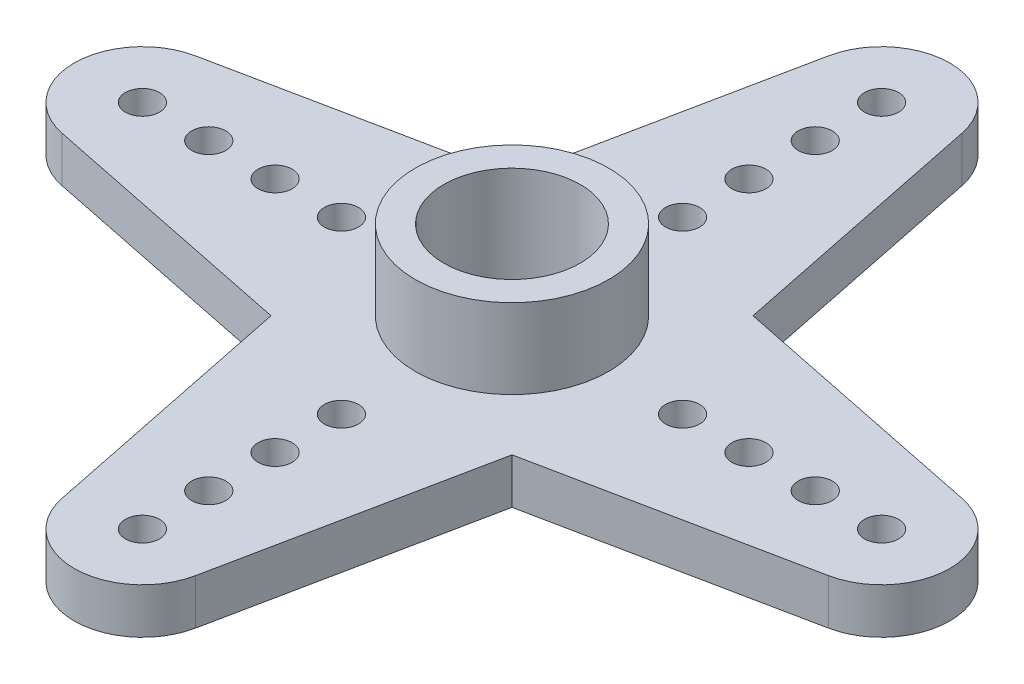
ISO-10303-21;
HEADER;
FILE_DESCRIPTION(('STEP AP214'),'2;1');
FILE_NAME('part.step','',(''),(''),'','','');
FILE_SCHEMA(('AUTOMOTIVE_DESIGN { 1 0 10303 214 1 1 1 1 }'));
ENDSEC;
DATA;
#1=APPLICATION_CONTEXT('core data for automotive mechanical design processes');
#2=APPLICATION_PROTOCOL_DEFINITION('international standard','automotive_design',2000,#1);
#3=PRODUCT_CONTEXT('',#1,'mechanical');
#4=PRODUCT('Part','Part','',(#3));
#5=PRODUCT_RELATED_PRODUCT_CATEGORY('part','',(#4));
#6=PRODUCT_DEFINITION_FORMATION('','',#4);
#7=PRODUCT_DEFINITION_CONTEXT('part definition',#1,'design');
#8=PRODUCT_DEFINITION('design','',#6,#7);
#9=PRODUCT_DEFINITION_SHAPE('','',#8);
#10=(LENGTH_UNIT() NAMED_UNIT(*) SI_UNIT(.MILLI.,.METRE.));
#11=(NAMED_UNIT(*) PLANE_ANGLE_UNIT() SI_UNIT($,.RADIAN.));
#12=(NAMED_UNIT(*) SI_UNIT($,.STERADIAN.) SOLID_ANGLE_UNIT());
#13=UNCERTAINTY_MEASURE_WITH_UNIT(LENGTH_MEASURE(1.E-05),#10,'distance_accuracy_value','');
#14=(GEOMETRIC_REPRESENTATION_CONTEXT(3) GLOBAL_UNCERTAINTY_ASSIGNED_CONTEXT((#13)) GLOBAL_UNIT_ASSIGNED_CONTEXT((#10,
#11,#12)) REPRESENTATION_CONTEXT('',''));
#15=CARTESIAN_POINT('',(0.,0.,0.));
#16=DIRECTION('',(0.,0.,1.));
#17=DIRECTION('',(1.,0.,0.));
#18=AXIS2_PLACEMENT_3D('',#15,#16,#17);
#19=CARTESIAN_POINT('',(6.12372435695795,2.,-1.25));
#20=DIRECTION('',(0.979795897113271,0.,-0.2));
#21=DIRECTION('',(-0.2,0.,-0.979795897113271));
#22=AXIS2_PLACEMENT_3D('',#19,#20,#21);
#23=PLANE('',#22);
#24=DIRECTION('',(0.2,0.,0.979795897113271));
#25=VECTOR('',#24,1.);
#26=CARTESIAN_POINT('',(6.12372435695795,0.,-1.25));
#27=LINE('',#26,#25);
#28=CARTESIAN_POINT('',(2.93938769133982,0.,-16.85));
#29=VERTEX_POINT('',#28);
#30=CARTESIAN_POINT('',(5.29752647495429,0.,-5.29752647495429));
#31=VERTEX_POINT('',#30);
#32=EDGE_CURVE('E207',#29,#31,#27,.T.);
#33=ORIENTED_EDGE('',*,*,#32,.F.);
#34=DIRECTION('',(0.,-1.,0.));
#35=VECTOR('',#34,1.);
#36=CARTESIAN_POINT('',(2.93938769133982,2.,-16.85));
#37=LINE('',#36,#35);
#38=CARTESIAN_POINT('',(2.93938769133982,2.,-16.85));
#39=VERTEX_POINT('',#38);
#40=EDGE_CURVE('E42',#39,#29,#37,.T.);
#41=ORIENTED_EDGE('',*,*,#40,.F.);
#42=DIRECTION('',(0.2,0.,0.979795897113271));
#43=VECTOR('',#42,1.);
#44=CARTESIAN_POINT('',(6.12372435695795,2.,-1.25));
#45=LINE('',#44,#43);
#46=CARTESIAN_POINT('',(5.29752647495429,2.,-5.29752647495429));
#47=VERTEX_POINT('',#46);
#48=EDGE_CURVE('E462',#39,#47,#45,.T.);
#49=ORIENTED_EDGE('',*,*,#48,.T.);
#50=DIRECTION('',(0.,-1.,0.));
#51=VECTOR('',#50,1.);
#52=CARTESIAN_POINT('',(5.29752647495429,2.,-5.29752647495429));
#53=LINE('',#52,#51);
#54=EDGE_CURVE('E50',#47,#31,#53,.T.);
#55=ORIENTED_EDGE('',*,*,#54,.T.);
#56=EDGE_LOOP('',(#33,#41,#49,#55));
#57=FACE_BOUND('',#56,.T.);
#58=ADVANCED_FACE('F33',(#57),#23,.T.);
#59=CARTESIAN_POINT('',(0.,2.,-16.25));
#60=DIRECTION('',(0.,-1.,0.));
#61=DIRECTION('',(0.,0.,-1.));
#62=AXIS2_PLACEMENT_3D('',#59,#60,#61);
#63=CYLINDRICAL_SURFACE('',#62,3.);
#64=CARTESIAN_POINT('',(0.,0.,-16.25));
#65=DIRECTION('',(0.,1.,0.));
#66=DIRECTION('',(0.,0.,1.));
#67=AXIS2_PLACEMENT_3D('',#64,#65,#66);
#68=CIRCLE('',#67,3.);
#69=CARTESIAN_POINT('',(-2.93938769133981,0.,-16.85));
#70=VERTEX_POINT('',#69);
#71=EDGE_CURVE('E209',#29,#70,#68,.T.);
#72=ORIENTED_EDGE('',*,*,#71,.T.);
#73=DIRECTION('',(0.,-1.,0.));
#74=VECTOR('',#73,1.);
#75=CARTESIAN_POINT('',(-2.93938769133981,2.,-16.85));
#76=LINE('',#75,#74);
#77=CARTESIAN_POINT('',(-2.93938769133981,2.,-16.85));
#78=VERTEX_POINT('',#77);
#79=EDGE_CURVE('E299',#78,#70,#76,.T.);
#80=ORIENTED_EDGE('',*,*,#79,.F.);
#81=CARTESIAN_POINT('',(0.,2.,-16.25));
#82=DIRECTION('',(0.,1.,0.));
#83=DIRECTION('',(0.,0.,1.));
#84=AXIS2_PLACEMENT_3D('',#81,#82,#83);
#85=CIRCLE('',#84,3.);
#86=EDGE_CURVE('E306',#39,#78,#85,.T.);
#87=ORIENTED_EDGE('',*,*,#86,.F.);
#88=ORIENTED_EDGE('',*,*,#40,.T.);
#89=EDGE_LOOP('',(#72,#80,#87,#88));
#90=FACE_BOUND('',#89,.T.);
#91=ADVANCED_FACE('F303',(#90),#63,.T.);
#92=CARTESIAN_POINT('',(-6.12372435695795,2.,-1.25));
#93=DIRECTION('',(0.979795897113271,0.,0.2));
#94=DIRECTION('',(0.2,0.,-0.979795897113271));
#95=AXIS2_PLACEMENT_3D('',#92,#93,#94);
#96=PLANE('',#95);
#97=DIRECTION('',(-0.2,0.,0.979795897113271));
#98=VECTOR('',#97,1.);
#99=CARTESIAN_POINT('',(-6.12372435695795,0.,-1.25));
#100=LINE('',#99,#98);
#101=CARTESIAN_POINT('',(-5.29752647495429,0.,-5.29752647495429));
#102=VERTEX_POINT('',#101);
#103=EDGE_CURVE('E212',#70,#102,#100,.T.);
#104=ORIENTED_EDGE('',*,*,#103,.T.);
#105=DIRECTION('',(0.,-1.,0.));
#106=VECTOR('',#105,1.);
#107=CARTESIAN_POINT('',(-5.29752647495429,2.,-5.29752647495429));
#108=LINE('',#107,#106);
#109=CARTESIAN_POINT('',(-5.29752647495429,2.,-5.29752647495429));
#110=VERTEX_POINT('',#109);
#111=EDGE_CURVE('E297',#110,#102,#108,.T.);
#112=ORIENTED_EDGE('',*,*,#111,.F.);
#113=DIRECTION('',(-0.2,0.,0.979795897113271));
#114=VECTOR('',#113,1.);
#115=CARTESIAN_POINT('',(-6.12372435695795,2.,-1.25));
#116=LINE('',#115,#114);
#117=EDGE_CURVE('E444',#78,#110,#116,.T.);
#118=ORIENTED_EDGE('',*,*,#117,.F.);
#119=ORIENTED_EDGE('',*,*,#79,.T.);
#120=EDGE_LOOP('',(#104,#112,#118,#119));
#121=FACE_BOUND('',#120,.T.);
#122=ADVANCED_FACE('F315',(#121),#96,.F.);
#123=CARTESIAN_POINT('',(-1.25,2.,-6.12372435695794));
#124=DIRECTION('',(-0.2,0.,-0.979795897113271));
#125=DIRECTION('',(-0.979795897113271,0.,0.2));
#126=AXIS2_PLACEMENT_3D('',#123,#124,#125);
#127=PLANE('',#126);
#128=DIRECTION('',(0.979795897113271,0.,-0.2));
#129=VECTOR('',#128,1.);
#130=CARTESIAN_POINT('',(-1.25,0.,-6.12372435695794));
#131=LINE('',#130,#129);
#132=CARTESIAN_POINT('',(-16.85,0.,-2.93938769133981));
#133=VERTEX_POINT('',#132);
#134=EDGE_CURVE('E215',#133,#102,#131,.T.);
#135=ORIENTED_EDGE('',*,*,#134,.F.);
#136=DIRECTION('',(0.,-1.,0.));
#137=VECTOR('',#136,1.);
#138=CARTESIAN_POINT('',(-16.85,2.,-2.93938769133981));
#139=LINE('',#138,#137);
#140=CARTESIAN_POINT('',(-16.85,2.,-2.93938769133981));
#141=VERTEX_POINT('',#140);
#142=EDGE_CURVE('E295',#141,#133,#139,.T.);
#143=ORIENTED_EDGE('',*,*,#142,.F.);
#144=DIRECTION('',(0.979795897113271,0.,-0.2));
#145=VECTOR('',#144,1.);
#146=CARTESIAN_POINT('',(-1.25,2.,-6.12372435695794));
#147=LINE('',#146,#145);
#148=EDGE_CURVE('E441',#141,#110,#147,.T.);
#149=ORIENTED_EDGE('',*,*,#148,.T.);
#150=ORIENTED_EDGE('',*,*,#111,.T.);
#151=EDGE_LOOP('',(#135,#143,#149,#150));
#152=FACE_BOUND('',#151,.T.);
#153=ADVANCED_FACE('F427',(#152),#127,.T.);
#154=CARTESIAN_POINT('',(-16.25,2.,0.));
#155=DIRECTION('',(0.,-1.,0.));
#156=DIRECTION('',(0.,0.,-1.));
#157=AXIS2_PLACEMENT_3D('',#154,#155,#156);
#158=CYLINDRICAL_SURFACE('',#157,3.);
#159=CARTESIAN_POINT('',(-16.25,0.,0.));
#160=DIRECTION('',(0.,1.,0.));
#161=DIRECTION('',(0.,0.,1.));
#162=AXIS2_PLACEMENT_3D('',#159,#160,#161);
#163=CIRCLE('',#162,3.);
#164=CARTESIAN_POINT('',(-16.85,0.,2.93938769133981));
#165=VERTEX_POINT('',#164);
#166=EDGE_CURVE('E218',#133,#165,#163,.T.);
#167=ORIENTED_EDGE('',*,*,#166,.T.);
#168=DIRECTION('',(0.,-1.,0.));
#169=VECTOR('',#168,1.);
#170=CARTESIAN_POINT('',(-16.85,2.,2.93938769133981));
#171=LINE('',#170,#169);
#172=CARTESIAN_POINT('',(-16.85,2.,2.93938769133981));
#173=VERTEX_POINT('',#172);
#174=EDGE_CURVE('E292',#173,#165,#171,.T.);
#175=ORIENTED_EDGE('',*,*,#174,.F.);
#176=CARTESIAN_POINT('',(-16.25,2.,0.));
#177=DIRECTION('',(0.,1.,0.));
#178=DIRECTION('',(0.,0.,1.));
#179=AXIS2_PLACEMENT_3D('',#176,#177,#178);
#180=CIRCLE('',#179,3.);
#181=EDGE_CURVE('E443',#141,#173,#180,.T.);
#182=ORIENTED_EDGE('',*,*,#181,.F.);
#183=ORIENTED_EDGE('',*,*,#142,.T.);
#184=EDGE_LOOP('',(#167,#175,#182,#183));
#185=FACE_BOUND('',#184,.T.);
#186=ADVANCED_FACE('F423',(#185),#158,.T.);
#187=CARTESIAN_POINT('',(-1.25,2.,6.12372435695794));
#188=DIRECTION('',(0.2,0.,-0.979795897113271));
#189=DIRECTION('',(-0.979795897113271,0.,-0.2));
#190=AXIS2_PLACEMENT_3D('',#187,#188,#189);
#191=PLANE('',#190);
#192=DIRECTION('',(0.979795897113271,0.,0.2));
#193=VECTOR('',#192,1.);
#194=CARTESIAN_POINT('',(-1.25,0.,6.12372435695794));
#195=LINE('',#194,#193);
#196=CARTESIAN_POINT('',(-5.29752647495429,0.,5.29752647495429));
#197=VERTEX_POINT('',#196);
#198=EDGE_CURVE('E221',#165,#197,#195,.T.);
#199=ORIENTED_EDGE('',*,*,#198,.T.);
#200=DIRECTION('',(0.,-1.,0.));
#201=VECTOR('',#200,1.);
#202=CARTESIAN_POINT('',(-5.29752647495429,2.,5.29752647495429));
#203=LINE('',#202,#201);
#204=CARTESIAN_POINT('',(-5.29752647495429,2.,5.29752647495429));
#205=VERTEX_POINT('',#204);
#206=EDGE_CURVE('E290',#205,#197,#203,.T.);
#207=ORIENTED_EDGE('',*,*,#206,.F.);
#208=DIRECTION('',(0.979795897113271,0.,0.2));
#209=VECTOR('',#208,1.);
#210=CARTESIAN_POINT('',(-1.25,2.,6.12372435695794));
#211=LINE('',#210,#209);
#212=EDGE_CURVE('E446',#173,#205,#211,.T.);
#213=ORIENTED_EDGE('',*,*,#212,.F.);
#214=ORIENTED_EDGE('',*,*,#174,.T.);
#215=EDGE_LOOP('',(#199,#207,#213,#214));
#216=FACE_BOUND('',#215,.T.);
#217=ADVANCED_FACE('F419',(#216),#191,.F.);
#218=CARTESIAN_POINT('',(-6.12372435695795,2.,1.25));
#219=DIRECTION('',(-0.979795897113271,0.,0.2));
#220=DIRECTION('',(0.2,0.,0.979795897113271));
#221=AXIS2_PLACEMENT_3D('',#218,#219,#220);
#222=PLANE('',#221);
#223=DIRECTION('',(-0.2,0.,-0.979795897113271));
#224=VECTOR('',#223,1.);
#225=CARTESIAN_POINT('',(-6.12372435695795,0.,1.25));
#226=LINE('',#225,#224);
#227=CARTESIAN_POINT('',(-2.93938769133981,0.,16.85));
#228=VERTEX_POINT('',#227);
#229=EDGE_CURVE('E224',#228,#197,#226,.T.);
#230=ORIENTED_EDGE('',*,*,#229,.F.);
#231=DIRECTION('',(0.,-1.,0.));
#232=VECTOR('',#231,1.);
#233=CARTESIAN_POINT('',(-2.93938769133981,2.,16.85));
#234=LINE('',#233,#232);
#235=CARTESIAN_POINT('',(-2.93938769133981,2.,16.85));
#236=VERTEX_POINT('',#235);
#237=EDGE_CURVE('E288',#236,#228,#234,.T.);
#238=ORIENTED_EDGE('',*,*,#237,.F.);
#239=DIRECTION('',(-0.2,0.,-0.979795897113271));
#240=VECTOR('',#239,1.);
#241=CARTESIAN_POINT('',(-6.12372435695795,2.,1.25));
#242=LINE('',#241,#240);
#243=EDGE_CURVE('E452',#236,#205,#242,.T.);
#244=ORIENTED_EDGE('',*,*,#243,.T.);
#245=ORIENTED_EDGE('',*,*,#206,.T.);
#246=EDGE_LOOP('',(#230,#238,#244,#245));
#247=FACE_BOUND('',#246,.T.);
#248=ADVANCED_FACE('F415',(#247),#222,.T.);
#249=CARTESIAN_POINT('',(0.,2.,16.25));
#250=DIRECTION('',(0.,-1.,0.));
#251=DIRECTION('',(0.,0.,-1.));
#252=AXIS2_PLACEMENT_3D('',#249,#250,#251);
#253=CYLINDRICAL_SURFACE('',#252,3.);
#254=CARTESIAN_POINT('',(0.,0.,16.25));
#255=DIRECTION('',(0.,1.,0.));
#256=DIRECTION('',(0.,0.,1.));
#257=AXIS2_PLACEMENT_3D('',#254,#255,#256);
#258=CIRCLE('',#257,3.);
#259=CARTESIAN_POINT('',(2.93938769133982,0.,16.85));
#260=VERTEX_POINT('',#259);
#261=EDGE_CURVE('E227',#228,#260,#258,.T.);
#262=ORIENTED_EDGE('',*,*,#261,.T.);
#263=DIRECTION('',(0.,-1.,0.));
#264=VECTOR('',#263,1.);
#265=CARTESIAN_POINT('',(2.93938769133982,2.,16.85));
#266=LINE('',#265,#264);
#267=CARTESIAN_POINT('',(2.93938769133982,2.,16.85));
#268=VERTEX_POINT('',#267);
#269=EDGE_CURVE('E285',#268,#260,#266,.T.);
#270=ORIENTED_EDGE('',*,*,#269,.F.);
#271=CARTESIAN_POINT('',(0.,2.,16.25));
#272=DIRECTION('',(0.,1.,0.));
#273=DIRECTION('',(0.,0.,1.));
#274=AXIS2_PLACEMENT_3D('',#271,#272,#273);
#275=CIRCLE('',#274,3.);
#276=EDGE_CURVE('E150',#236,#268,#275,.T.);
#277=ORIENTED_EDGE('',*,*,#276,.F.);
#278=ORIENTED_EDGE('',*,*,#237,.T.);
#279=EDGE_LOOP('',(#262,#270,#277,#278));
#280=FACE_BOUND('',#279,.T.);
#281=ADVANCED_FACE('F411',(#280),#253,.T.);
#282=CARTESIAN_POINT('',(6.12372435695795,2.,1.25));
#283=DIRECTION('',(-0.979795897113271,0.,-0.2));
#284=DIRECTION('',(-0.2,0.,0.979795897113271));
#285=AXIS2_PLACEMENT_3D('',#282,#283,#284);
#286=PLANE('',#285);
#287=DIRECTION('',(0.2,0.,-0.979795897113271));
#288=VECTOR('',#287,1.);
#289=CARTESIAN_POINT('',(6.12372435695795,0.,1.25));
#290=LINE('',#289,#288);
#291=CARTESIAN_POINT('',(5.29752647495429,0.,5.29752647495429));
#292=VERTEX_POINT('',#291);
#293=EDGE_CURVE('E230',#260,#292,#290,.T.);
#294=ORIENTED_EDGE('',*,*,#293,.T.);
#295=DIRECTION('',(0.,-1.,0.));
#296=VECTOR('',#295,1.);
#297=CARTESIAN_POINT('',(5.29752647495429,2.,5.29752647495429));
#298=LINE('',#297,#296);
#299=CARTESIAN_POINT('',(5.29752647495429,2.,5.29752647495429));
#300=VERTEX_POINT('',#299);
#301=EDGE_CURVE('E135',#300,#292,#298,.T.);
#302=ORIENTED_EDGE('',*,*,#301,.F.);
#303=DIRECTION('',(0.2,0.,-0.979795897113271));
#304=VECTOR('',#303,1.);
#305=CARTESIAN_POINT('',(6.12372435695795,2.,1.25));
#306=LINE('',#305,#304);
#307=EDGE_CURVE('E147',#268,#300,#306,.T.);
#308=ORIENTED_EDGE('',*,*,#307,.F.);
#309=ORIENTED_EDGE('',*,*,#269,.T.);
#310=EDGE_LOOP('',(#294,#302,#308,#309));
#311=FACE_BOUND('',#310,.T.);
#312=ADVANCED_FACE('F408',(#311),#286,.F.);
#313=CARTESIAN_POINT('',(1.25,2.,6.12372435695794));
#314=DIRECTION('',(0.2,0.,0.979795897113271));
#315=DIRECTION('',(0.979795897113271,0.,-0.2));
#316=AXIS2_PLACEMENT_3D('',#313,#314,#315);
#317=PLANE('',#316);
#318=DIRECTION('',(-0.979795897113271,0.,0.2));
#319=VECTOR('',#318,1.);
#320=CARTESIAN_POINT('',(1.25,0.,6.12372435695794));
#321=LINE('',#320,#319);
#322=CARTESIAN_POINT('',(16.85,0.,2.93938769133981));
#323=VERTEX_POINT('',#322);
#324=EDGE_CURVE('E132',#323,#292,#321,.T.);
#325=ORIENTED_EDGE('',*,*,#324,.F.);
#326=DIRECTION('',(0.,-1.,0.));
#327=VECTOR('',#326,1.);
#328=CARTESIAN_POINT('',(16.85,2.,2.93938769133981));
#329=LINE('',#328,#327);
#330=CARTESIAN_POINT('',(16.85,2.,2.93938769133981));
#331=VERTEX_POINT('',#330);
#332=EDGE_CURVE('E126',#331,#323,#329,.T.);
#333=ORIENTED_EDGE('',*,*,#332,.F.);
#334=DIRECTION('',(-0.979795897113271,0.,0.2));
#335=VECTOR('',#334,1.);
#336=CARTESIAN_POINT('',(1.25,2.,6.12372435695794));
#337=LINE('',#336,#335);
#338=EDGE_CURVE('E130',#331,#300,#337,.T.);
#339=ORIENTED_EDGE('',*,*,#338,.T.);
#340=ORIENTED_EDGE('',*,*,#301,.T.);
#341=EDGE_LOOP('',(#325,#333,#339,#340));
#342=FACE_BOUND('',#341,.T.);
#343=ADVANCED_FACE('F128',(#342),#317,.T.);
#344=CARTESIAN_POINT('',(16.25,2.,0.));
#345=DIRECTION('',(0.,-1.,0.));
#346=DIRECTION('',(0.,0.,-1.));
#347=AXIS2_PLACEMENT_3D('',#344,#345,#346);
#348=CYLINDRICAL_SURFACE('',#347,3.);
#349=CARTESIAN_POINT('',(16.25,0.,0.));
#350=DIRECTION('',(0.,1.,0.));
#351=DIRECTION('',(0.,0.,1.));
#352=AXIS2_PLACEMENT_3D('',#349,#350,#351);
#353=CIRCLE('',#352,3.);
#354=CARTESIAN_POINT('',(16.85,0.,-2.93938769133982));
#355=VERTEX_POINT('',#354);
#356=EDGE_CURVE('E234',#323,#355,#353,.T.);
#357=ORIENTED_EDGE('',*,*,#356,.T.);
#358=DIRECTION('',(0.,-1.,0.));
#359=VECTOR('',#358,1.);
#360=CARTESIAN_POINT('',(16.85,2.,-2.93938769133982));
#361=LINE('',#360,#359);
#362=CARTESIAN_POINT('',(16.85,2.,-2.93938769133982));
#363=VERTEX_POINT('',#362);
#364=EDGE_CURVE('E89',#363,#355,#361,.T.);
#365=ORIENTED_EDGE('',*,*,#364,.F.);
#366=CARTESIAN_POINT('',(16.25,2.,0.));
#367=DIRECTION('',(0.,1.,0.));
#368=DIRECTION('',(0.,0.,1.));
#369=AXIS2_PLACEMENT_3D('',#366,#367,#368);
#370=CIRCLE('',#369,3.);
#371=EDGE_CURVE('E137',#331,#363,#370,.T.);
#372=ORIENTED_EDGE('',*,*,#371,.F.);
#373=ORIENTED_EDGE('',*,*,#332,.T.);
#374=EDGE_LOOP('',(#357,#365,#372,#373));
#375=FACE_BOUND('',#374,.T.);
#376=ADVANCED_FACE('F138',(#375),#348,.T.);
#377=CARTESIAN_POINT('',(0.,2.,16.25));
#378=DIRECTION('',(0.,-1.,0.));
#379=DIRECTION('',(0.,0.,-1.));
#380=AXIS2_PLACEMENT_3D('',#377,#378,#379);
#381=CYLINDRICAL_SURFACE('',#380,0.75);
#382=CARTESIAN_POINT('',(0.,2.,16.25));
#383=DIRECTION('',(0.,1.,0.));
#384=DIRECTION('',(0.,0.,1.));
#385=AXIS2_PLACEMENT_3D('',#382,#383,#384);
#386=CIRCLE('',#385,0.75);
#387=CARTESIAN_POINT('',(0.,2.,17.));
#388=VERTEX_POINT('',#387);
#389=EDGE_CURVE('E194',#388,#388,#386,.T.);
#390=ORIENTED_EDGE('',*,*,#389,.T.);
#391=EDGE_LOOP('',(#390));
#392=FACE_BOUND('',#391,.T.);
#393=CARTESIAN_POINT('',(0.,0.,16.25));
#394=DIRECTION('',(0.,1.,0.));
#395=DIRECTION('',(0.,0.,1.));
#396=AXIS2_PLACEMENT_3D('',#393,#394,#395);
#397=CIRCLE('',#396,0.75);
#398=CARTESIAN_POINT('',(0.,0.,17.));
#399=VERTEX_POINT('',#398);
#400=EDGE_CURVE('E275',#399,#399,#397,.T.);
#401=ORIENTED_EDGE('',*,*,#400,.F.);
#402=EDGE_LOOP('',(#401));
#403=FACE_BOUND('',#402,.T.);
#404=ADVANCED_FACE('F353',(#392,#403),#381,.F.);
#405=CARTESIAN_POINT('',(0.,2.,-16.25));
#406=DIRECTION('',(0.,-1.,0.));
#407=DIRECTION('',(0.,0.,-1.));
#408=AXIS2_PLACEMENT_3D('',#405,#406,#407);
#409=CYLINDRICAL_SURFACE('',#408,0.75);
#410=CARTESIAN_POINT('',(0.,2.,-16.25));
#411=DIRECTION('',(0.,1.,0.));
#412=DIRECTION('',(0.,0.,1.));
#413=AXIS2_PLACEMENT_3D('',#410,#411,#412);
#414=CIRCLE('',#413,0.75);
#415=CARTESIAN_POINT('',(0.,2.,-15.5));
#416=VERTEX_POINT('',#415);
#417=EDGE_CURVE('E191',#416,#416,#414,.T.);
#418=ORIENTED_EDGE('',*,*,#417,.T.);
#419=EDGE_LOOP('',(#418));
#420=FACE_BOUND('',#419,.T.);
#421=CARTESIAN_POINT('',(0.,0.,-16.25));
#422=DIRECTION('',(0.,1.,0.));
#423=DIRECTION('',(0.,0.,1.));
#424=AXIS2_PLACEMENT_3D('',#421,#422,#423);
#425=CIRCLE('',#424,0.75);
#426=CARTESIAN_POINT('',(0.,0.,-15.5));
#427=VERTEX_POINT('',#426);
#428=EDGE_CURVE('E272',#427,#427,#425,.T.);
#429=ORIENTED_EDGE('',*,*,#428,.F.);
#430=EDGE_LOOP('',(#429));
#431=FACE_BOUND('',#430,.T.);
#432=ADVANCED_FACE('F356',(#420,#431),#409,.F.);
#433=CARTESIAN_POINT('',(0.,2.,7.5));
#434=DIRECTION('',(0.,-1.,0.));
#435=DIRECTION('',(0.,0.,-1.));
#436=AXIS2_PLACEMENT_3D('',#433,#434,#435);
#437=CYLINDRICAL_SURFACE('',#436,0.75);
#438=CARTESIAN_POINT('',(0.,2.,7.5));
#439=DIRECTION('',(0.,1.,0.));
#440=DIRECTION('',(0.,0.,1.));
#441=AXIS2_PLACEMENT_3D('',#438,#439,#440);
#442=CIRCLE('',#441,0.75);
#443=CARTESIAN_POINT('',(0.,2.,8.25));
#444=VERTEX_POINT('',#443);
#445=EDGE_CURVE('E188',#444,#444,#442,.T.);
#446=ORIENTED_EDGE('',*,*,#445,.T.);
#447=EDGE_LOOP('',(#446));
#448=FACE_BOUND('',#447,.T.);
#449=CARTESIAN_POINT('',(0.,0.,7.5));
#450=DIRECTION('',(0.,1.,0.));
#451=DIRECTION('',(0.,0.,1.));
#452=AXIS2_PLACEMENT_3D('',#449,#450,#451);
#453=CIRCLE('',#452,0.75);
#454=CARTESIAN_POINT('',(0.,0.,8.25));
#455=VERTEX_POINT('',#454);
#456=EDGE_CURVE('E269',#455,#455,#453,.T.);
#457=ORIENTED_EDGE('',*,*,#456,.F.);
#458=EDGE_LOOP('',(#457));
#459=FACE_BOUND('',#458,.T.);
#460=ADVANCED_FACE('F360',(#448,#459),#437,.F.);
#461=CARTESIAN_POINT('',(0.,2.,10.4166666666667));
#462=DIRECTION('',(0.,-1.,0.));
#463=DIRECTION('',(0.,0.,-1.));
#464=AXIS2_PLACEMENT_3D('',#461,#462,#463);
#465=CYLINDRICAL_SURFACE('',#464,0.750000000000001);
#466=CARTESIAN_POINT('',(0.,2.,10.4166666666667));
#467=DIRECTION('',(0.,1.,0.));
#468=DIRECTION('',(0.,0.,1.));
#469=AXIS2_PLACEMENT_3D('',#466,#467,#468);
#470=CIRCLE('',#469,0.750000000000001);
#471=CARTESIAN_POINT('',(0.,2.,11.1666666666667));
#472=VERTEX_POINT('',#471);
#473=EDGE_CURVE('E185',#472,#472,#470,.T.);
#474=ORIENTED_EDGE('',*,*,#473,.T.);
#475=EDGE_LOOP('',(#474));
#476=FACE_BOUND('',#475,.T.);
#477=CARTESIAN_POINT('',(0.,0.,10.4166666666667));
#478=DIRECTION('',(0.,1.,0.));
#479=DIRECTION('',(0.,0.,1.));
#480=AXIS2_PLACEMENT_3D('',#477,#478,#479);
#481=CIRCLE('',#480,0.750000000000001);
#482=CARTESIAN_POINT('',(0.,0.,11.1666666666667));
#483=VERTEX_POINT('',#482);
#484=EDGE_CURVE('E266',#483,#483,#481,.T.);
#485=ORIENTED_EDGE('',*,*,#484,.F.);
#486=EDGE_LOOP('',(#485));
#487=FACE_BOUND('',#486,.T.);
#488=ADVANCED_FACE('F364',(#476,#487),#465,.F.);
#489=CARTESIAN_POINT('',(7.5,2.,0.));
#490=DIRECTION('',(0.,-1.,0.));
#491=DIRECTION('',(0.,0.,-1.));
#492=AXIS2_PLACEMENT_3D('',#489,#490,#491);
#493=CYLINDRICAL_SURFACE('',#492,0.75);
#494=CARTESIAN_POINT('',(7.5,2.,0.));
#495=DIRECTION('',(0.,1.,0.));
#496=DIRECTION('',(0.,0.,1.));
#497=AXIS2_PLACEMENT_3D('',#494,#495,#496);
#498=CIRCLE('',#497,0.75);
#499=CARTESIAN_POINT('',(7.5,2.,0.749999999999998));
#500=VERTEX_POINT('',#499);
#501=EDGE_CURVE('E182',#500,#500,#498,.T.);
#502=ORIENTED_EDGE('',*,*,#501,.T.);
#503=EDGE_LOOP('',(#502));
#504=FACE_BOUND('',#503,.T.);
#505=CARTESIAN_POINT('',(7.5,0.,0.));
#506=DIRECTION('',(0.,1.,0.));
#507=DIRECTION('',(0.,0.,1.));
#508=AXIS2_PLACEMENT_3D('',#505,#506,#507);
#509=CIRCLE('',#508,0.75);
#510=CARTESIAN_POINT('',(7.5,0.,0.749999999999998));
#511=VERTEX_POINT('',#510);
#512=EDGE_CURVE('E263',#511,#511,#509,.T.);
#513=ORIENTED_EDGE('',*,*,#512,.F.);
#514=EDGE_LOOP('',(#513));
#515=FACE_BOUND('',#514,.T.);
#516=ADVANCED_FACE('F368',(#504,#515),#493,.F.);
#517=CARTESIAN_POINT('',(10.4166666666667,2.,0.));
#518=DIRECTION('',(0.,-1.,0.));
#519=DIRECTION('',(0.,0.,-1.));
#520=AXIS2_PLACEMENT_3D('',#517,#518,#519);
#521=CYLINDRICAL_SURFACE('',#520,0.75);
#522=CARTESIAN_POINT('',(10.4166666666667,2.,0.));
#523=DIRECTION('',(0.,1.,0.));
#524=DIRECTION('',(0.,0.,1.));
#525=AXIS2_PLACEMENT_3D('',#522,#523,#524);
#526=CIRCLE('',#525,0.75);
#527=CARTESIAN_POINT('',(10.4166666666667,2.,0.749999999999998));
#528=VERTEX_POINT('',#527);
#529=EDGE_CURVE('E179',#528,#528,#526,.T.);
#530=ORIENTED_EDGE('',*,*,#529,.T.);
#531=EDGE_LOOP('',(#530));
#532=FACE_BOUND('',#531,.T.);
#533=CARTESIAN_POINT('',(10.4166666666667,0.,0.));
#534=DIRECTION('',(0.,1.,0.));
#535=DIRECTION('',(0.,0.,1.));
#536=AXIS2_PLACEMENT_3D('',#533,#534,#535);
#537=CIRCLE('',#536,0.75);
#538=CARTESIAN_POINT('',(10.4166666666667,0.,0.749999999999998));
#539=VERTEX_POINT('',#538);
#540=EDGE_CURVE('E260',#539,#539,#537,.T.);
#541=ORIENTED_EDGE('',*,*,#540,.F.);
#542=EDGE_LOOP('',(#541));
#543=FACE_BOUND('',#542,.T.);
#544=ADVANCED_FACE('F372',(#532,#543),#521,.F.);
#545=CARTESIAN_POINT('',(0.,2.,-7.5));
#546=DIRECTION('',(0.,-1.,0.));
#547=DIRECTION('',(0.,0.,-1.));
#548=AXIS2_PLACEMENT_3D('',#545,#546,#547);
#549=CYLINDRICAL_SURFACE('',#548,0.75);
#550=CARTESIAN_POINT('',(0.,2.,-7.5));
#551=DIRECTION('',(0.,1.,0.));
#552=DIRECTION('',(0.,0.,1.));
#553=AXIS2_PLACEMENT_3D('',#550,#551,#552);
#554=CIRCLE('',#553,0.75);
#555=CARTESIAN_POINT('',(0.,2.,-6.75));
#556=VERTEX_POINT('',#555);
#557=EDGE_CURVE('E176',#556,#556,#554,.T.);
#558=ORIENTED_EDGE('',*,*,#557,.T.);
#559=EDGE_LOOP('',(#558));
#560=FACE_BOUND('',#559,.T.);
#561=CARTESIAN_POINT('',(0.,0.,-7.5));
#562=DIRECTION('',(0.,1.,0.));
#563=DIRECTION('',(0.,0.,1.));
#564=AXIS2_PLACEMENT_3D('',#561,#562,#563);
#565=CIRCLE('',#564,0.75);
#566=CARTESIAN_POINT('',(0.,0.,-6.75));
#567=VERTEX_POINT('',#566);
#568=EDGE_CURVE('E257',#567,#567,#565,.T.);
#569=ORIENTED_EDGE('',*,*,#568,.F.);
#570=EDGE_LOOP('',(#569));
#571=FACE_BOUND('',#570,.T.);
#572=ADVANCED_FACE('F376',(#560,#571),#549,.F.);
#573=CARTESIAN_POINT('',(0.,2.,-10.4166666666667));
#574=DIRECTION('',(0.,-1.,0.));
#575=DIRECTION('',(0.,0.,-1.));
#576=AXIS2_PLACEMENT_3D('',#573,#574,#575);
#577=CYLINDRICAL_SURFACE('',#576,0.750000000000001);
#578=CARTESIAN_POINT('',(0.,2.,-10.4166666666667));
#579=DIRECTION('',(0.,1.,0.));
#580=DIRECTION('',(0.,0.,1.));
#581=AXIS2_PLACEMENT_3D('',#578,#579,#580);
#582=CIRCLE('',#581,0.750000000000001);
#583=CARTESIAN_POINT('',(0.,2.,-9.66666666666667));
#584=VERTEX_POINT('',#583);
#585=EDGE_CURVE('E173',#584,#584,#582,.T.);
#586=ORIENTED_EDGE('',*,*,#585,.T.);
#587=EDGE_LOOP('',(#586));
#588=FACE_BOUND('',#587,.T.);
#589=CARTESIAN_POINT('',(0.,0.,-10.4166666666667));
#590=DIRECTION('',(0.,1.,0.));
#591=DIRECTION('',(0.,0.,1.));
#592=AXIS2_PLACEMENT_3D('',#589,#590,#591);
#593=CIRCLE('',#592,0.750000000000001);
#594=CARTESIAN_POINT('',(0.,0.,-9.66666666666667));
#595=VERTEX_POINT('',#594);
#596=EDGE_CURVE('E254',#595,#595,#593,.T.);
#597=ORIENTED_EDGE('',*,*,#596,.F.);
#598=EDGE_LOOP('',(#597));
#599=FACE_BOUND('',#598,.T.);
#600=ADVANCED_FACE('F380',(#588,#599),#577,.F.);
#601=CARTESIAN_POINT('',(-16.25,2.,0.));
#602=DIRECTION('',(0.,-1.,0.));
#603=DIRECTION('',(0.,0.,-1.));
#604=AXIS2_PLACEMENT_3D('',#601,#602,#603);
#605=CYLINDRICAL_SURFACE('',#604,0.75);
#606=CARTESIAN_POINT('',(-16.25,2.,0.));
#607=DIRECTION('',(0.,1.,0.));
#608=DIRECTION('',(0.,0.,1.));
#609=AXIS2_PLACEMENT_3D('',#606,#607,#608);
#610=CIRCLE('',#609,0.75);
#611=CARTESIAN_POINT('',(-16.25,2.,0.75));
#612=VERTEX_POINT('',#611);
#613=EDGE_CURVE('E170',#612,#612,#610,.T.);
#614=ORIENTED_EDGE('',*,*,#613,.T.);
#615=EDGE_LOOP('',(#614));
#616=FACE_BOUND('',#615,.T.);
#617=CARTESIAN_POINT('',(-16.25,0.,0.));
#618=DIRECTION('',(0.,1.,0.));
#619=DIRECTION('',(0.,0.,1.));
#620=AXIS2_PLACEMENT_3D('',#617,#618,#619);
#621=CIRCLE('',#620,0.75);
#622=CARTESIAN_POINT('',(-16.25,0.,0.75));
#623=VERTEX_POINT('',#622);
#624=EDGE_CURVE('E251',#623,#623,#621,.T.);
#625=ORIENTED_EDGE('',*,*,#624,.F.);
#626=EDGE_LOOP('',(#625));
#627=FACE_BOUND('',#626,.T.);
#628=ADVANCED_FACE('F384',(#616,#627),#605,.F.);
#629=CARTESIAN_POINT('',(-13.3333333333333,2.,0.));
#630=DIRECTION('',(0.,-1.,0.));
#631=DIRECTION('',(0.,0.,-1.));
#632=AXIS2_PLACEMENT_3D('',#629,#630,#631);
#633=CYLINDRICAL_SURFACE('',#632,0.75);
#634=CARTESIAN_POINT('',(-13.3333333333333,2.,0.));
#635=DIRECTION('',(0.,1.,0.));
#636=DIRECTION('',(0.,0.,1.));
#637=AXIS2_PLACEMENT_3D('',#634,#635,#636);
#638=CIRCLE('',#637,0.75);
#639=CARTESIAN_POINT('',(-13.3333333333333,2.,0.750000000000001));
#640=VERTEX_POINT('',#639);
#641=EDGE_CURVE('E164',#640,#640,#638,.T.);
#642=ORIENTED_EDGE('',*,*,#641,.T.);
#643=EDGE_LOOP('',(#642));
#644=FACE_BOUND('',#643,.T.);
#645=CARTESIAN_POINT('',(-13.3333333333333,0.,0.));
#646=DIRECTION('',(0.,1.,0.));
#647=DIRECTION('',(0.,0.,1.));
#648=AXIS2_PLACEMENT_3D('',#645,#646,#647);
#649=CIRCLE('',#648,0.75);
#650=CARTESIAN_POINT('',(-13.3333333333333,0.,0.750000000000001));
#651=VERTEX_POINT('',#650);
#652=EDGE_CURVE('E248',#651,#651,#649,.T.);
#653=ORIENTED_EDGE('',*,*,#652,.F.);
#654=EDGE_LOOP('',(#653));
#655=FACE_BOUND('',#654,.T.);
#656=ADVANCED_FACE('F388',(#644,#655),#633,.F.);
#657=CARTESIAN_POINT('',(-7.5,2.,0.));
#658=DIRECTION('',(0.,-1.,0.));
#659=DIRECTION('',(0.,0.,-1.));
#660=AXIS2_PLACEMENT_3D('',#657,#658,#659);
#661=CYLINDRICAL_SURFACE('',#660,0.75);
#662=CARTESIAN_POINT('',(-7.5,2.,0.));
#663=DIRECTION('',(0.,1.,0.));
#664=DIRECTION('',(0.,0.,1.));
#665=AXIS2_PLACEMENT_3D('',#662,#663,#664);
#666=CIRCLE('',#665,0.75);
#667=CARTESIAN_POINT('',(-7.5,2.,0.75));
#668=VERTEX_POINT('',#667);
#669=EDGE_CURVE('E161',#668,#668,#666,.T.);
#670=ORIENTED_EDGE('',*,*,#669,.T.);
#671=EDGE_LOOP('',(#670));
#672=FACE_BOUND('',#671,.T.);
#673=CARTESIAN_POINT('',(-7.5,0.,0.));
#674=DIRECTION('',(0.,1.,0.));
#675=DIRECTION('',(0.,0.,1.));
#676=AXIS2_PLACEMENT_3D('',#673,#674,#675);
#677=CIRCLE('',#676,0.75);
#678=CARTESIAN_POINT('',(-7.5,0.,0.75));
#679=VERTEX_POINT('',#678);
#680=EDGE_CURVE('E245',#679,#679,#677,.T.);
#681=ORIENTED_EDGE('',*,*,#680,.F.);
#682=EDGE_LOOP('',(#681));
#683=FACE_BOUND('',#682,.T.);
#684=ADVANCED_FACE('F392',(#672,#683),#661,.F.);
#685=CARTESIAN_POINT('',(-10.4166666666667,2.,0.));
#686=DIRECTION('',(0.,-1.,0.));
#687=DIRECTION('',(0.,0.,-1.));
#688=AXIS2_PLACEMENT_3D('',#685,#686,#687);
#689=CYLINDRICAL_SURFACE('',#688,0.75);
#690=CARTESIAN_POINT('',(-10.4166666666667,2.,0.));
#691=DIRECTION('',(0.,1.,0.));
#692=DIRECTION('',(0.,0.,1.));
#693=AXIS2_PLACEMENT_3D('',#690,#691,#692);
#694=CIRCLE('',#693,0.75);
#695=CARTESIAN_POINT('',(-10.4166666666667,2.,0.750000000000001));
#696=VERTEX_POINT('',#695);
#697=EDGE_CURVE('E158',#696,#696,#694,.T.);
#698=ORIENTED_EDGE('',*,*,#697,.T.);
#699=EDGE_LOOP('',(#698));
#700=FACE_BOUND('',#699,.T.);
#701=CARTESIAN_POINT('',(-10.4166666666667,0.,0.));
#702=DIRECTION('',(0.,1.,0.));
#703=DIRECTION('',(0.,0.,1.));
#704=AXIS2_PLACEMENT_3D('',#701,#702,#703);
#705=CIRCLE('',#704,0.75);
#706=CARTESIAN_POINT('',(-10.4166666666667,0.,0.750000000000001));
#707=VERTEX_POINT('',#706);
#708=EDGE_CURVE('E242',#707,#707,#705,.T.);
#709=ORIENTED_EDGE('',*,*,#708,.F.);
#710=EDGE_LOOP('',(#709));
#711=FACE_BOUND('',#710,.T.);
#712=ADVANCED_FACE('F396',(#700,#711),#689,.F.);
#713=CARTESIAN_POINT('',(0.,2.,-13.3333333333333));
#714=DIRECTION('',(0.,-1.,0.));
#715=DIRECTION('',(0.,0.,-1.));
#716=AXIS2_PLACEMENT_3D('',#713,#714,#715);
#717=CYLINDRICAL_SURFACE('',#716,0.750000000000001);
#718=CARTESIAN_POINT('',(0.,2.,-13.3333333333333));
#719=DIRECTION('',(0.,1.,0.));
#720=DIRECTION('',(0.,0.,1.));
#721=AXIS2_PLACEMENT_3D('',#718,#719,#720);
#722=CIRCLE('',#721,0.750000000000001);
#723=CARTESIAN_POINT('',(0.,2.,-12.5833333333333));
#724=VERTEX_POINT('',#723);
#725=EDGE_CURVE('E155',#724,#724,#722,.T.);
#726=ORIENTED_EDGE('',*,*,#725,.T.);
#727=EDGE_LOOP('',(#726));
#728=FACE_BOUND('',#727,.T.);
#729=CARTESIAN_POINT('',(0.,0.,-13.3333333333333));
#730=DIRECTION('',(0.,1.,0.));
#731=DIRECTION('',(0.,0.,1.));
#732=AXIS2_PLACEMENT_3D('',#729,#730,#731);
#733=CIRCLE('',#732,0.750000000000001);
#734=CARTESIAN_POINT('',(0.,0.,-12.5833333333333));
#735=VERTEX_POINT('',#734);
#736=EDGE_CURVE('E239',#735,#735,#733,.T.);
#737=ORIENTED_EDGE('',*,*,#736,.F.);
#738=EDGE_LOOP('',(#737));
#739=FACE_BOUND('',#738,.T.);
#740=ADVANCED_FACE('F328',(#728,#739),#717,.F.);
#741=CARTESIAN_POINT('',(1.25,2.,-6.12372435695795));
#742=DIRECTION('',(0.2,0.,-0.979795897113271));
#743=DIRECTION('',(-0.979795897113271,0.,-0.2));
#744=AXIS2_PLACEMENT_3D('',#741,#742,#743);
#745=PLANE('',#744);
#746=DIRECTION('',(0.979795897113271,0.,0.2));
#747=VECTOR('',#746,1.);
#748=CARTESIAN_POINT('',(1.25,0.,-6.12372435695795));
#749=LINE('',#748,#747);
#750=EDGE_CURVE('E236',#31,#355,#749,.T.);
#751=ORIENTED_EDGE('',*,*,#750,.F.);
#752=ORIENTED_EDGE('',*,*,#54,.F.);
#753=DIRECTION('',(0.979795897113271,0.,0.2));
#754=VECTOR('',#753,1.);
#755=CARTESIAN_POINT('',(1.25,2.,-6.12372435695795));
#756=LINE('',#755,#754);
#757=EDGE_CURVE('E141',#47,#363,#756,.T.);
#758=ORIENTED_EDGE('',*,*,#757,.T.);
#759=ORIENTED_EDGE('',*,*,#364,.T.);
#760=EDGE_LOOP('',(#751,#752,#758,#759));
#761=FACE_BOUND('',#760,.T.);
#762=ADVANCED_FACE('F320',(#761),#745,.T.);
#763=CARTESIAN_POINT('',(0.,2.,13.3333333333333));
#764=DIRECTION('',(0.,-1.,0.));
#765=DIRECTION('',(0.,0.,-1.));
#766=AXIS2_PLACEMENT_3D('',#763,#764,#765);
#767=CYLINDRICAL_SURFACE('',#766,0.750000000000001);
#768=CARTESIAN_POINT('',(0.,2.,13.3333333333333));
#769=DIRECTION('',(0.,1.,0.));
#770=DIRECTION('',(0.,0.,1.));
#771=AXIS2_PLACEMENT_3D('',#768,#769,#770);
#772=CIRCLE('',#771,0.750000000000001);
#773=CARTESIAN_POINT('',(0.,2.,14.0833333333333));
#774=VERTEX_POINT('',#773);
#775=EDGE_CURVE('E333',#774,#774,#772,.T.);
#776=ORIENTED_EDGE('',*,*,#775,.T.);
#777=EDGE_LOOP('',(#776));
#778=FACE_BOUND('',#777,.T.);
#779=CARTESIAN_POINT('',(0.,0.,13.3333333333333));
#780=DIRECTION('',(0.,1.,0.));
#781=DIRECTION('',(0.,0.,1.));
#782=AXIS2_PLACEMENT_3D('',#779,#780,#781);
#783=CIRCLE('',#782,0.750000000000001);
#784=CARTESIAN_POINT('',(0.,0.,14.0833333333333));
#785=VERTEX_POINT('',#784);
#786=EDGE_CURVE('E203',#785,#785,#783,.T.);
#787=ORIENTED_EDGE('',*,*,#786,.F.);
#788=EDGE_LOOP('',(#787));
#789=FACE_BOUND('',#788,.T.);
#790=ADVANCED_FACE('F318',(#778,#789),#767,.F.);
#791=CARTESIAN_POINT('',(13.3333333333333,2.,0.));
#792=DIRECTION('',(0.,-1.,0.));
#793=DIRECTION('',(0.,0.,-1.));
#794=AXIS2_PLACEMENT_3D('',#791,#792,#793);
#795=CYLINDRICAL_SURFACE('',#794,0.75);
#796=CARTESIAN_POINT('',(13.3333333333333,2.,0.));
#797=DIRECTION('',(0.,1.,0.));
#798=DIRECTION('',(0.,0.,1.));
#799=AXIS2_PLACEMENT_3D('',#796,#797,#798);
#800=CIRCLE('',#799,0.75);
#801=CARTESIAN_POINT('',(13.3333333333333,2.,0.749999999999998));
#802=VERTEX_POINT('',#801);
#803=EDGE_CURVE('E281',#802,#802,#800,.T.);
#804=ORIENTED_EDGE('',*,*,#803,.T.);
#805=EDGE_LOOP('',(#804));
#806=FACE_BOUND('',#805,.T.);
#807=CARTESIAN_POINT('',(13.3333333333333,0.,0.));
#808=DIRECTION('',(0.,1.,0.));
#809=DIRECTION('',(0.,0.,1.));
#810=AXIS2_PLACEMENT_3D('',#807,#808,#809);
#811=CIRCLE('',#810,0.75);
#812=CARTESIAN_POINT('',(13.3333333333333,0.,0.749999999999998));
#813=VERTEX_POINT('',#812);
#814=EDGE_CURVE('E200',#813,#813,#811,.T.);
#815=ORIENTED_EDGE('',*,*,#814,.F.);
#816=EDGE_LOOP('',(#815));
#817=FACE_BOUND('',#816,.T.);
#818=ADVANCED_FACE('F35',(#806,#817),#795,.F.);
#819=CARTESIAN_POINT('',(16.25,2.,0.));
#820=DIRECTION('',(0.,-1.,0.));
#821=DIRECTION('',(0.,0.,-1.));
#822=AXIS2_PLACEMENT_3D('',#819,#820,#821);
#823=CYLINDRICAL_SURFACE('',#822,0.750000000000002);
#824=CARTESIAN_POINT('',(16.25,2.,0.));
#825=DIRECTION('',(0.,1.,0.));
#826=DIRECTION('',(0.,0.,1.));
#827=AXIS2_PLACEMENT_3D('',#824,#825,#826);
#828=CIRCLE('',#827,0.750000000000002);
#829=CARTESIAN_POINT('',(16.25,2.,0.749999999999998));
#830=VERTEX_POINT('',#829);
#831=EDGE_CURVE('E197',#830,#830,#828,.T.);
#832=ORIENTED_EDGE('',*,*,#831,.T.);
#833=EDGE_LOOP('',(#832));
#834=FACE_BOUND('',#833,.T.);
#835=CARTESIAN_POINT('',(16.25,0.,0.));
#836=DIRECTION('',(0.,1.,0.));
#837=DIRECTION('',(0.,0.,1.));
#838=AXIS2_PLACEMENT_3D('',#835,#836,#837);
#839=CIRCLE('',#838,0.750000000000002);
#840=CARTESIAN_POINT('',(16.25,0.,0.749999999999998));
#841=VERTEX_POINT('',#840);
#842=EDGE_CURVE('E278',#841,#841,#839,.T.);
#843=ORIENTED_EDGE('',*,*,#842,.F.);
#844=EDGE_LOOP('',(#843));
#845=FACE_BOUND('',#844,.T.);
#846=ADVANCED_FACE('F326',(#834,#845),#823,.F.);
#847=CARTESIAN_POINT('',(0.,2.,0.));
#848=DIRECTION('',(0.,1.,0.));
#849=DIRECTION('',(0.,0.,1.));
#850=AXIS2_PLACEMENT_3D('',#847,#848,#849);
#851=PLANE('',#850);
#852=ORIENTED_EDGE('',*,*,#803,.F.);
#853=EDGE_LOOP('',(#852));
#854=FACE_BOUND('',#853,.T.);
#855=ORIENTED_EDGE('',*,*,#775,.F.);
#856=EDGE_LOOP('',(#855));
#857=FACE_BOUND('',#856,.T.);
#858=ORIENTED_EDGE('',*,*,#48,.F.);
#859=ORIENTED_EDGE('',*,*,#86,.T.);
#860=ORIENTED_EDGE('',*,*,#117,.T.);
#861=ORIENTED_EDGE('',*,*,#148,.F.);
#862=ORIENTED_EDGE('',*,*,#181,.T.);
#863=ORIENTED_EDGE('',*,*,#212,.T.);
#864=ORIENTED_EDGE('',*,*,#243,.F.);
#865=ORIENTED_EDGE('',*,*,#276,.T.);
#866=ORIENTED_EDGE('',*,*,#307,.T.);
#867=ORIENTED_EDGE('',*,*,#338,.F.);
#868=ORIENTED_EDGE('',*,*,#371,.T.);
#869=ORIENTED_EDGE('',*,*,#757,.F.);
#870=EDGE_LOOP('',(#858,#859,#860,#861,#862,#863,#864,#865,#866,#867,#868,#869));
#871=FACE_BOUND('',#870,.T.);
#872=ORIENTED_EDGE('',*,*,#725,.F.);
#873=EDGE_LOOP('',(#872));
#874=FACE_BOUND('',#873,.T.);
#875=ORIENTED_EDGE('',*,*,#697,.F.);
#876=EDGE_LOOP('',(#875));
#877=FACE_BOUND('',#876,.T.);
#878=ORIENTED_EDGE('',*,*,#669,.F.);
#879=EDGE_LOOP('',(#878));
#880=FACE_BOUND('',#879,.T.);
#881=ORIENTED_EDGE('',*,*,#641,.F.);
#882=EDGE_LOOP('',(#881));
#883=FACE_BOUND('',#882,.T.);
#884=CARTESIAN_POINT('',(0.,2.,0.));
#885=DIRECTION('',(0.,1.,0.));
#886=DIRECTION('',(0.,0.,1.));
#887=AXIS2_PLACEMENT_3D('',#884,#885,#886);
#888=CIRCLE('',#887,4.25);
#889=CARTESIAN_POINT('',(0.,2.,4.25));
#890=VERTEX_POINT('',#889);
#891=EDGE_CURVE('E167',#890,#890,#888,.T.);
#892=ORIENTED_EDGE('',*,*,#891,.F.);
#893=EDGE_LOOP('',(#892));
#894=FACE_BOUND('',#893,.T.);
#895=ORIENTED_EDGE('',*,*,#613,.F.);
#896=EDGE_LOOP('',(#895));
#897=FACE_BOUND('',#896,.T.);
#898=ORIENTED_EDGE('',*,*,#585,.F.);
#899=EDGE_LOOP('',(#898));
#900=FACE_BOUND('',#899,.T.);
#901=ORIENTED_EDGE('',*,*,#557,.F.);
#902=EDGE_LOOP('',(#901));
#903=FACE_BOUND('',#902,.T.);
#904=ORIENTED_EDGE('',*,*,#529,.F.);
#905=EDGE_LOOP('',(#904));
#906=FACE_BOUND('',#905,.T.);
#907=ORIENTED_EDGE('',*,*,#501,.F.);
#908=EDGE_LOOP('',(#907));
#909=FACE_BOUND('',#908,.T.);
#910=ORIENTED_EDGE('',*,*,#473,.F.);
#911=EDGE_LOOP('',(#910));
#912=FACE_BOUND('',#911,.T.);
#913=ORIENTED_EDGE('',*,*,#445,.F.);
#914=EDGE_LOOP('',(#913));
#915=FACE_BOUND('',#914,.T.);
#916=ORIENTED_EDGE('',*,*,#417,.F.);
#917=EDGE_LOOP('',(#916));
#918=FACE_BOUND('',#917,.T.);
#919=ORIENTED_EDGE('',*,*,#389,.F.);
#920=EDGE_LOOP('',(#919));
#921=FACE_BOUND('',#920,.T.);
#922=ORIENTED_EDGE('',*,*,#831,.F.);
#923=EDGE_LOOP('',(#922));
#924=FACE_BOUND('',#923,.T.);
#925=ADVANCED_FACE('F144',(#854,#857,#871,#874,#877,#880,#883,#894,#897,#900,#903,#906,#909,
#912,#915,#918,#921,#924),#851,.T.);
#926=CARTESIAN_POINT('',(0.,0.,0.));
#927=DIRECTION('',(0.,1.,0.));
#928=DIRECTION('',(0.,0.,1.));
#929=AXIS2_PLACEMENT_3D('',#926,#927,#928);
#930=PLANE('',#929);
#931=ORIENTED_EDGE('',*,*,#814,.T.);
#932=EDGE_LOOP('',(#931));
#933=FACE_BOUND('',#932,.T.);
#934=ORIENTED_EDGE('',*,*,#786,.T.);
#935=EDGE_LOOP('',(#934));
#936=FACE_BOUND('',#935,.T.);
#937=ORIENTED_EDGE('',*,*,#32,.T.);
#938=ORIENTED_EDGE('',*,*,#750,.T.);
#939=ORIENTED_EDGE('',*,*,#356,.F.);
#940=ORIENTED_EDGE('',*,*,#324,.T.);
#941=ORIENTED_EDGE('',*,*,#293,.F.);
#942=ORIENTED_EDGE('',*,*,#261,.F.);
#943=ORIENTED_EDGE('',*,*,#229,.T.);
#944=ORIENTED_EDGE('',*,*,#198,.F.);
#945=ORIENTED_EDGE('',*,*,#166,.F.);
#946=ORIENTED_EDGE('',*,*,#134,.T.);
#947=ORIENTED_EDGE('',*,*,#103,.F.);
#948=ORIENTED_EDGE('',*,*,#71,.F.);
#949=EDGE_LOOP('',(#937,#938,#939,#940,#941,#942,#943,#944,#945,#946,#947,#948));
#950=FACE_BOUND('',#949,.T.);
#951=ORIENTED_EDGE('',*,*,#736,.T.);
#952=EDGE_LOOP('',(#951));
#953=FACE_BOUND('',#952,.T.);
#954=ORIENTED_EDGE('',*,*,#708,.T.);
#955=EDGE_LOOP('',(#954));
#956=FACE_BOUND('',#955,.T.);
#957=ORIENTED_EDGE('',*,*,#680,.T.);
#958=EDGE_LOOP('',(#957));
#959=FACE_BOUND('',#958,.T.);
#960=ORIENTED_EDGE('',*,*,#652,.T.);
#961=EDGE_LOOP('',(#960));
#962=FACE_BOUND('',#961,.T.);
#963=ORIENTED_EDGE('',*,*,#624,.T.);
#964=EDGE_LOOP('',(#963));
#965=FACE_BOUND('',#964,.T.);
#966=ORIENTED_EDGE('',*,*,#596,.T.);
#967=EDGE_LOOP('',(#966));
#968=FACE_BOUND('',#967,.T.);
#969=ORIENTED_EDGE('',*,*,#568,.T.);
#970=EDGE_LOOP('',(#969));
#971=FACE_BOUND('',#970,.T.);
#972=ORIENTED_EDGE('',*,*,#540,.T.);
#973=EDGE_LOOP('',(#972));
#974=FACE_BOUND('',#973,.T.);
#975=ORIENTED_EDGE('',*,*,#512,.T.);
#976=EDGE_LOOP('',(#975));
#977=FACE_BOUND('',#976,.T.);
#978=ORIENTED_EDGE('',*,*,#484,.T.);
#979=EDGE_LOOP('',(#978));
#980=FACE_BOUND('',#979,.T.);
#981=ORIENTED_EDGE('',*,*,#456,.T.);
#982=EDGE_LOOP('',(#981));
#983=FACE_BOUND('',#982,.T.);
#984=ORIENTED_EDGE('',*,*,#428,.T.);
#985=EDGE_LOOP('',(#984));
#986=FACE_BOUND('',#985,.T.);
#987=ORIENTED_EDGE('',*,*,#400,.T.);
#988=EDGE_LOOP('',(#987));
#989=FACE_BOUND('',#988,.T.);
#990=ORIENTED_EDGE('',*,*,#842,.T.);
#991=EDGE_LOOP('',(#990));
#992=FACE_BOUND('',#991,.T.);
#993=CARTESIAN_POINT('',(0.,0.,0.));
#994=DIRECTION('',(0.,1.,0.));
#995=DIRECTION('',(0.,0.,1.));
#996=AXIS2_PLACEMENT_3D('',#993,#994,#995);
#997=CIRCLE('',#996,1.5);
#998=CARTESIAN_POINT('',(0.,0.,1.5));
#999=VERTEX_POINT('',#998);
#1000=EDGE_CURVE('E473',#999,#999,#997,.T.);
#1001=ORIENTED_EDGE('',*,*,#1000,.T.);
#1002=EDGE_LOOP('',(#1001));
#1003=FACE_BOUND('',#1002,.T.);
#1004=ADVANCED_FACE('F308',(#933,#936,#950,#953,#956,#959,#962,#965,#968,#971,#974,#977,#980,
#983,#986,#989,#992,#1003),#930,.F.);
#1005=CARTESIAN_POINT('',(0.,5.5,0.));
#1006=DIRECTION('',(0.,-1.,0.));
#1007=DIRECTION('',(0.,0.,-1.));
#1008=AXIS2_PLACEMENT_3D('',#1005,#1006,#1007);
#1009=CYLINDRICAL_SURFACE('',#1008,3.);
#1010=CARTESIAN_POINT('',(0.,1.,0.));
#1011=DIRECTION('',(0.,1.,0.));
#1012=DIRECTION('',(0.,0.,1.));
#1013=AXIS2_PLACEMENT_3D('',#1010,#1011,#1012);
#1014=CIRCLE('',#1013,3.);
#1015=CARTESIAN_POINT('',(0.,1.,3.));
#1016=VERTEX_POINT('',#1015);
#1017=EDGE_CURVE('E11',#1016,#1016,#1014,.T.);
#1018=ORIENTED_EDGE('',*,*,#1017,.F.);
#1019=EDGE_LOOP('',(#1018));
#1020=FACE_BOUND('',#1019,.T.);
#1021=CARTESIAN_POINT('',(0.,5.5,0.));
#1022=DIRECTION('',(0.,1.,0.));
#1023=DIRECTION('',(0.,0.,1.));
#1024=AXIS2_PLACEMENT_3D('',#1021,#1022,#1023);
#1025=CIRCLE('',#1024,3.);
#1026=CARTESIAN_POINT('',(0.,5.5,3.));
#1027=VERTEX_POINT('',#1026);
#1028=EDGE_CURVE('E469',#1027,#1027,#1025,.T.);
#1029=ORIENTED_EDGE('',*,*,#1028,.T.);
#1030=EDGE_LOOP('',(#1029));
#1031=FACE_BOUND('',#1030,.T.);
#1032=ADVANCED_FACE('F337',(#1020,#1031),#1009,.F.);
#1033=CARTESIAN_POINT('',(0.,5.5,0.));
#1034=DIRECTION('',(0.,-1.,0.));
#1035=DIRECTION('',(0.,0.,-1.));
#1036=AXIS2_PLACEMENT_3D('',#1033,#1034,#1035);
#1037=CYLINDRICAL_SURFACE('',#1036,4.25);
#1038=ORIENTED_EDGE('',*,*,#891,.T.);
#1039=EDGE_LOOP('',(#1038));
#1040=FACE_BOUND('',#1039,.T.);
#1041=CARTESIAN_POINT('',(0.,5.5,0.));
#1042=DIRECTION('',(0.,1.,0.));
#1043=DIRECTION('',(0.,0.,1.));
#1044=AXIS2_PLACEMENT_3D('',#1041,#1042,#1043);
#1045=CIRCLE('',#1044,4.25);
#1046=CARTESIAN_POINT('',(0.,5.5,4.25));
#1047=VERTEX_POINT('',#1046);
#1048=EDGE_CURVE('E204',#1047,#1047,#1045,.T.);
#1049=ORIENTED_EDGE('',*,*,#1048,.F.);
#1050=EDGE_LOOP('',(#1049));
#1051=FACE_BOUND('',#1050,.T.);
#1052=ADVANCED_FACE('F344',(#1040,#1051),#1037,.T.);
#1053=CARTESIAN_POINT('',(0.,5.5,0.));
#1054=DIRECTION('',(0.,1.,0.));
#1055=DIRECTION('',(0.,0.,1.));
#1056=AXIS2_PLACEMENT_3D('',#1053,#1054,#1055);
#1057=PLANE('',#1056);
#1058=ORIENTED_EDGE('',*,*,#1028,.F.);
#1059=EDGE_LOOP('',(#1058));
#1060=FACE_BOUND('',#1059,.T.);
#1061=ORIENTED_EDGE('',*,*,#1048,.T.);
#1062=EDGE_LOOP('',(#1061));
#1063=FACE_BOUND('',#1062,.T.);
#1064=ADVANCED_FACE('F490',(#1060,#1063),#1057,.T.);
#1065=CARTESIAN_POINT('',(0.,1.,0.));
#1066=DIRECTION('',(0.,-1.,0.));
#1067=DIRECTION('',(0.,0.,-1.));
#1068=AXIS2_PLACEMENT_3D('',#1065,#1066,#1067);
#1069=CYLINDRICAL_SURFACE('',#1068,1.5);
#1070=CARTESIAN_POINT('',(0.,1.,0.));
#1071=DIRECTION('',(0.,1.,0.));
#1072=DIRECTION('',(0.,0.,1.));
#1073=AXIS2_PLACEMENT_3D('',#1070,#1071,#1072);
#1074=CIRCLE('',#1073,1.5);
#1075=CARTESIAN_POINT('',(0.,1.,1.5));
#1076=VERTEX_POINT('',#1075);
#1077=EDGE_CURVE('E472',#1076,#1076,#1074,.T.);
#1078=ORIENTED_EDGE('',*,*,#1077,.T.);
#1079=EDGE_LOOP('',(#1078));
#1080=FACE_BOUND('',#1079,.T.);
#1081=ORIENTED_EDGE('',*,*,#1000,.F.);
#1082=EDGE_LOOP('',(#1081));
#1083=FACE_BOUND('',#1082,.T.);
#1084=ADVANCED_FACE('F479',(#1080,#1083),#1069,.F.);
#1085=CARTESIAN_POINT('',(0.,1.,0.));
#1086=DIRECTION('',(0.,1.,0.));
#1087=DIRECTION('',(0.,0.,1.));
#1088=AXIS2_PLACEMENT_3D('',#1085,#1086,#1087);
#1089=PLANE('',#1088);
#1090=ORIENTED_EDGE('',*,*,#1077,.F.);
#1091=EDGE_LOOP('',(#1090));
#1092=FACE_BOUND('',#1091,.T.);
#1093=ORIENTED_EDGE('',*,*,#1017,.T.);
#1094=EDGE_LOOP('',(#1093));
#1095=FACE_BOUND('',#1094,.T.);
#1096=ADVANCED_FACE('F482',(#1092,#1095),#1089,.T.);
#1097=CLOSED_SHELL('',(#58,#91,#122,#153,#186,#217,#248,#281,#312,#343,#376,#404,#432,#460,#488,
#516,#544,#572,#600,#628,#656,#684,#712,#740,#762,#790,#818,#846,#925,#1004,#1032,#1052,#1064,
#1084,#1096));
#1098=MANIFOLD_SOLID_BREP('B2',#1097);
#1099=ADVANCED_BREP_SHAPE_REPRESENTATION('',(#18,#1098),#14);
#1100=SHAPE_DEFINITION_REPRESENTATION(#9,#1099);
ENDSEC;
END-ISO-10303-21;
